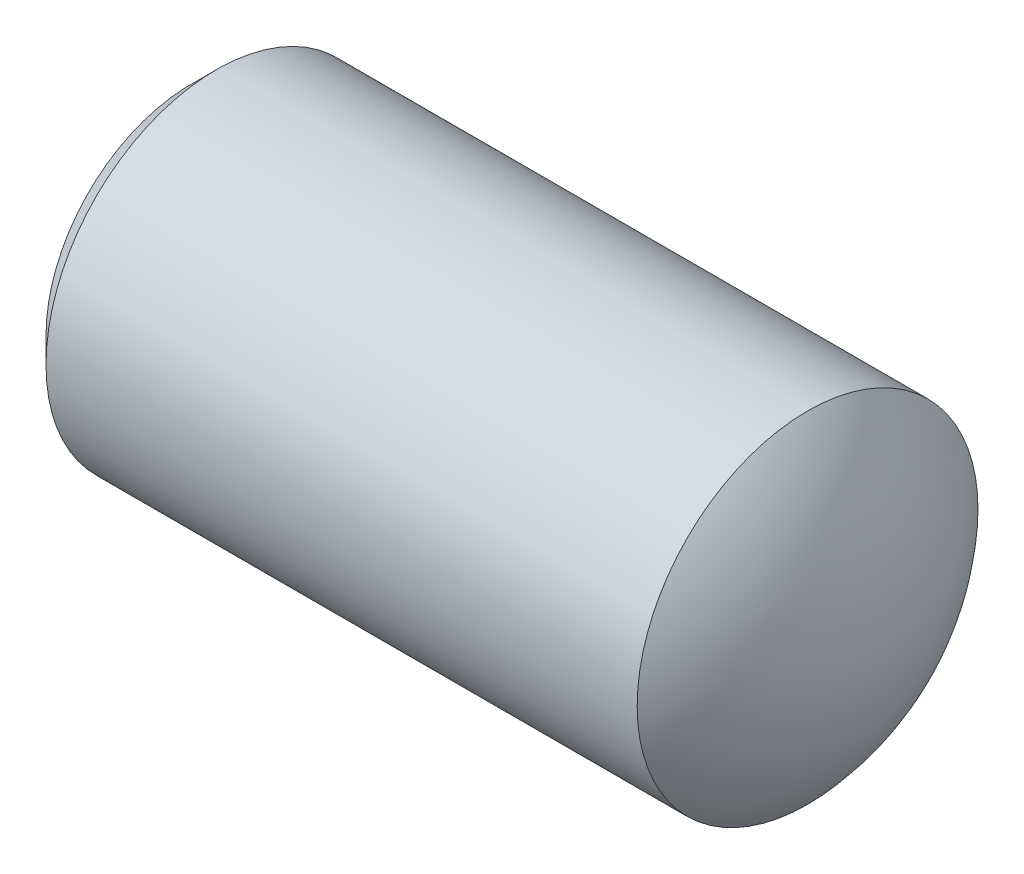
ISO-10303-21;
HEADER;
FILE_DESCRIPTION(('STEP AP214'),'2;1');
FILE_NAME('part.step','',(''),(''),'','','');
FILE_SCHEMA(('AUTOMOTIVE_DESIGN { 1 0 10303 214 1 1 1 1 }'));
ENDSEC;
DATA;
#1=APPLICATION_CONTEXT('core data for automotive mechanical design processes');
#2=APPLICATION_PROTOCOL_DEFINITION('international standard','automotive_design',2000,#1);
#3=PRODUCT_CONTEXT('',#1,'mechanical');
#4=PRODUCT('Part','Part','',(#3));
#5=PRODUCT_RELATED_PRODUCT_CATEGORY('part','',(#4));
#6=PRODUCT_DEFINITION_FORMATION('','',#4);
#7=PRODUCT_DEFINITION_CONTEXT('part definition',#1,'design');
#8=PRODUCT_DEFINITION('design','',#6,#7);
#9=PRODUCT_DEFINITION_SHAPE('','',#8);
#10=(LENGTH_UNIT() NAMED_UNIT(*) SI_UNIT(.MILLI.,.METRE.));
#11=(NAMED_UNIT(*) PLANE_ANGLE_UNIT() SI_UNIT($,.RADIAN.));
#12=(NAMED_UNIT(*) SI_UNIT($,.STERADIAN.) SOLID_ANGLE_UNIT());
#13=UNCERTAINTY_MEASURE_WITH_UNIT(LENGTH_MEASURE(1.E-05),#10,'distance_accuracy_value','');
#14=(GEOMETRIC_REPRESENTATION_CONTEXT(3) GLOBAL_UNCERTAINTY_ASSIGNED_CONTEXT((#13)) GLOBAL_UNIT_ASSIGNED_CONTEXT((#10,
#11,#12)) REPRESENTATION_CONTEXT('',''));
#15=CARTESIAN_POINT('',(0.,0.,0.));
#16=DIRECTION('',(0.,0.,1.));
#17=DIRECTION('',(1.,0.,0.));
#18=AXIS2_PLACEMENT_3D('',#15,#16,#17);
#19=CARTESIAN_POINT('',(0.,0.,0.));
#20=DIRECTION('',(-1.,0.,0.));
#21=DIRECTION('',(0.,0.,1.));
#22=AXIS2_PLACEMENT_3D('',#19,#20,#21);
#23=PLANE('',#22);
#24=CARTESIAN_POINT('',(0.,0.,0.));
#25=DIRECTION('',(-1.,0.,0.));
#26=DIRECTION('',(0.,0.,1.));
#27=AXIS2_PLACEMENT_3D('',#24,#25,#26);
#28=CIRCLE('',#27,10.81024);
#29=CARTESIAN_POINT('',(0.,0.,10.81024));
#30=VERTEX_POINT('',#29);
#31=EDGE_CURVE('E134',#30,#30,#28,.T.);
#32=ORIENTED_EDGE('',*,*,#31,.T.);
#33=EDGE_LOOP('',(#32));
#34=FACE_BOUND('',#33,.T.);
#35=DIRECTION('',(0.,0.,-1.));
#36=VECTOR('',#35,1.);
#37=CARTESIAN_POINT('',(0.,7.1374,4.12077981131403));
#38=LINE('',#37,#36);
#39=CARTESIAN_POINT('',(0.,7.1374,4.12077981131403));
#40=VERTEX_POINT('',#39);
#41=CARTESIAN_POINT('',(0.,7.1374,-4.12077981131404));
#42=VERTEX_POINT('',#41);
#43=EDGE_CURVE('E125',#40,#42,#38,.T.);
#44=ORIENTED_EDGE('',*,*,#43,.F.);
#45=DIRECTION('',(0.,-0.866025403784439,0.5));
#46=VECTOR('',#45,1.);
#47=CARTESIAN_POINT('',(0.,7.1374,4.12077981131403));
#48=LINE('',#47,#46);
#49=CARTESIAN_POINT('',(0.,0.,8.24155962262807));
#50=VERTEX_POINT('',#49);
#51=EDGE_CURVE('E47',#40,#50,#48,.T.);
#52=ORIENTED_EDGE('',*,*,#51,.T.);
#53=DIRECTION('',(0.,0.866025403784439,0.5));
#54=VECTOR('',#53,1.);
#55=CARTESIAN_POINT('',(0.,-7.13739999999999,4.12077981131404));
#56=LINE('',#55,#54);
#57=CARTESIAN_POINT('',(0.,-7.13739999999999,4.12077981131404));
#58=VERTEX_POINT('',#57);
#59=EDGE_CURVE('E116',#58,#50,#56,.T.);
#60=ORIENTED_EDGE('',*,*,#59,.F.);
#61=DIRECTION('',(0.,0.,-1.));
#62=VECTOR('',#61,1.);
#63=CARTESIAN_POINT('',(0.,-7.13739999999999,4.12077981131404));
#64=LINE('',#63,#62);
#65=CARTESIAN_POINT('',(0.,-7.13739999999999,-4.12077981131403));
#66=VERTEX_POINT('',#65);
#67=EDGE_CURVE('E119',#58,#66,#64,.T.);
#68=ORIENTED_EDGE('',*,*,#67,.T.);
#69=DIRECTION('',(0.,0.866025403784438,-0.500000000000001));
#70=VECTOR('',#69,1.);
#71=CARTESIAN_POINT('',(0.,-7.13739999999999,-4.12077981131403));
#72=LINE('',#71,#70);
#73=CARTESIAN_POINT('',(0.,0.,-8.24155962262807));
#74=VERTEX_POINT('',#73);
#75=EDGE_CURVE('E122',#66,#74,#72,.T.);
#76=ORIENTED_EDGE('',*,*,#75,.T.);
#77=DIRECTION('',(0.,-0.866025403784439,-0.5));
#78=VECTOR('',#77,1.);
#79=CARTESIAN_POINT('',(0.,7.1374,-4.12077981131404));
#80=LINE('',#79,#78);
#81=EDGE_CURVE('E105',#42,#74,#80,.T.);
#82=ORIENTED_EDGE('',*,*,#81,.F.);
#83=EDGE_LOOP('',(#44,#52,#60,#68,#76,#82));
#84=FACE_BOUND('',#83,.T.);
#85=ADVANCED_FACE('F32',(#34,#84),#23,.T.);
#86=CARTESIAN_POINT('',(31.75,0.,0.));
#87=DIRECTION('',(-1.,0.,0.));
#88=DIRECTION('',(0.,1.,0.));
#89=AXIS2_PLACEMENT_3D('',#86,#87,#88);
#90=SPHERICAL_SURFACE('',#89,19.05);
#91=CARTESIAN_POINT('',(45.9490316571237,0.,0.));
#92=DIRECTION('',(-1.,0.,0.));
#93=DIRECTION('',(0.,0.,1.));
#94=AXIS2_PLACEMENT_3D('',#91,#92,#93);
#95=CIRCLE('',#94,12.7);
#96=CARTESIAN_POINT('',(45.9490316571237,0.,12.7));
#97=VERTEX_POINT('',#96);
#98=EDGE_CURVE('E11',#97,#97,#95,.T.);
#99=ORIENTED_EDGE('',*,*,#98,.F.);
#100=EDGE_LOOP('',(#99));
#101=FACE_BOUND('',#100,.T.);
#102=ADVANCED_FACE('F34',(#101),#90,.T.);
#103=CARTESIAN_POINT('',(-12.7,0.,0.));
#104=DIRECTION('',(-1.,0.,0.));
#105=DIRECTION('',(0.,0.,1.));
#106=AXIS2_PLACEMENT_3D('',#103,#104,#105);
#107=CYLINDRICAL_SURFACE('',#106,12.7);
#108=ORIENTED_EDGE('',*,*,#98,.T.);
#109=EDGE_LOOP('',(#108));
#110=FACE_BOUND('',#109,.T.);
#111=CARTESIAN_POINT('',(1.88976,0.,0.));
#112=DIRECTION('',(-1.,0.,0.));
#113=DIRECTION('',(0.,0.,1.));
#114=AXIS2_PLACEMENT_3D('',#111,#112,#113);
#115=CIRCLE('',#114,12.7);
#116=CARTESIAN_POINT('',(1.88976,0.,12.7));
#117=VERTEX_POINT('',#116);
#118=EDGE_CURVE('E40',#117,#117,#115,.T.);
#119=ORIENTED_EDGE('',*,*,#118,.F.);
#120=EDGE_LOOP('',(#119));
#121=FACE_BOUND('',#120,.T.);
#122=ADVANCED_FACE('F142',(#110,#121),#107,.T.);
#123=CARTESIAN_POINT('',(0.,0.,0.));
#124=DIRECTION('',(1.,0.,0.));
#125=DIRECTION('',(0.,0.,-1.));
#126=AXIS2_PLACEMENT_3D('',#123,#124,#125);
#127=CONICAL_SURFACE('',#126,10.81024,0.785398163397449);
#128=ORIENTED_EDGE('',*,*,#118,.T.);
#129=EDGE_LOOP('',(#128));
#130=FACE_BOUND('',#129,.T.);
#131=ORIENTED_EDGE('',*,*,#31,.F.);
#132=EDGE_LOOP('',(#131));
#133=FACE_BOUND('',#132,.T.);
#134=ADVANCED_FACE('F139',(#130,#133),#127,.T.);
#135=CARTESIAN_POINT('',(14.2748,7.1374,4.12077981131403));
#136=DIRECTION('',(0.,-0.5,-0.866025403784438));
#137=DIRECTION('',(0.,0.866025403784439,-0.5));
#138=AXIS2_PLACEMENT_3D('',#135,#136,#137);
#139=PLANE('',#138);
#140=ORIENTED_EDGE('',*,*,#51,.F.);
#141=DIRECTION('',(-1.,0.,0.));
#142=VECTOR('',#141,1.);
#143=CARTESIAN_POINT('',(14.2748,7.1374,4.12077981131403));
#144=LINE('',#143,#142);
#145=CARTESIAN_POINT('',(14.2748,7.1374,4.12077981131403));
#146=VERTEX_POINT('',#145);
#147=EDGE_CURVE('E52',#146,#40,#144,.T.);
#148=ORIENTED_EDGE('',*,*,#147,.F.);
#149=DIRECTION('',(0.,-0.866025403784439,0.5));
#150=VECTOR('',#149,1.);
#151=CARTESIAN_POINT('',(14.2748,7.1374,4.12077981131403));
#152=LINE('',#151,#150);
#153=CARTESIAN_POINT('',(14.2748,0.,8.24155962262807));
#154=VERTEX_POINT('',#153);
#155=EDGE_CURVE('E79',#146,#154,#152,.T.);
#156=ORIENTED_EDGE('',*,*,#155,.T.);
#157=DIRECTION('',(-1.,0.,0.));
#158=VECTOR('',#157,1.);
#159=CARTESIAN_POINT('',(14.2748,0.,8.24155962262807));
#160=LINE('',#159,#158);
#161=EDGE_CURVE('E132',#154,#50,#160,.T.);
#162=ORIENTED_EDGE('',*,*,#161,.T.);
#163=EDGE_LOOP('',(#140,#148,#156,#162));
#164=FACE_BOUND('',#163,.T.);
#165=ADVANCED_FACE('F149',(#164),#139,.T.);
#166=CARTESIAN_POINT('',(14.2748,-7.13739999999999,4.12077981131404));
#167=DIRECTION('',(0.,-0.5,0.866025403784439));
#168=DIRECTION('',(0.,-0.866025403784439,-0.5));
#169=AXIS2_PLACEMENT_3D('',#166,#167,#168);
#170=PLANE('',#169);
#171=ORIENTED_EDGE('',*,*,#59,.T.);
#172=ORIENTED_EDGE('',*,*,#161,.F.);
#173=DIRECTION('',(0.,0.866025403784439,0.5));
#174=VECTOR('',#173,1.);
#175=CARTESIAN_POINT('',(14.2748,-7.13739999999999,4.12077981131404));
#176=LINE('',#175,#174);
#177=CARTESIAN_POINT('',(14.2748,-7.13739999999999,4.12077981131404));
#178=VERTEX_POINT('',#177);
#179=EDGE_CURVE('E245',#178,#154,#176,.T.);
#180=ORIENTED_EDGE('',*,*,#179,.F.);
#181=DIRECTION('',(-1.,0.,0.));
#182=VECTOR('',#181,1.);
#183=CARTESIAN_POINT('',(14.2748,-7.13739999999999,4.12077981131404));
#184=LINE('',#183,#182);
#185=EDGE_CURVE('E130',#178,#58,#184,.T.);
#186=ORIENTED_EDGE('',*,*,#185,.T.);
#187=EDGE_LOOP('',(#171,#172,#180,#186));
#188=FACE_BOUND('',#187,.T.);
#189=ADVANCED_FACE('F161',(#188),#170,.F.);
#190=CARTESIAN_POINT('',(14.2748,-7.13739999999999,4.12077981131404));
#191=DIRECTION('',(0.,1.,0.));
#192=DIRECTION('',(0.,0.,1.));
#193=AXIS2_PLACEMENT_3D('',#190,#191,#192);
#194=PLANE('',#193);
#195=ORIENTED_EDGE('',*,*,#67,.F.);
#196=ORIENTED_EDGE('',*,*,#185,.F.);
#197=DIRECTION('',(0.,0.,-1.));
#198=VECTOR('',#197,1.);
#199=CARTESIAN_POINT('',(14.2748,-7.13739999999999,4.12077981131404));
#200=LINE('',#199,#198);
#201=CARTESIAN_POINT('',(14.2748,-7.13739999999999,-4.12077981131403));
#202=VERTEX_POINT('',#201);
#203=EDGE_CURVE('E100',#178,#202,#200,.T.);
#204=ORIENTED_EDGE('',*,*,#203,.T.);
#205=DIRECTION('',(-1.,0.,0.));
#206=VECTOR('',#205,1.);
#207=CARTESIAN_POINT('',(14.2748,-7.13739999999999,-4.12077981131403));
#208=LINE('',#207,#206);
#209=EDGE_CURVE('E95',#202,#66,#208,.T.);
#210=ORIENTED_EDGE('',*,*,#209,.T.);
#211=EDGE_LOOP('',(#195,#196,#204,#210));
#212=FACE_BOUND('',#211,.T.);
#213=ADVANCED_FACE('F164',(#212),#194,.T.);
#214=CARTESIAN_POINT('',(14.2748,-7.13739999999999,-4.12077981131403));
#215=DIRECTION('',(0.,0.500000000000001,0.866025403784438));
#216=DIRECTION('',(0.,-0.866025403784438,0.500000000000001));
#217=AXIS2_PLACEMENT_3D('',#214,#215,#216);
#218=PLANE('',#217);
#219=ORIENTED_EDGE('',*,*,#75,.F.);
#220=ORIENTED_EDGE('',*,*,#209,.F.);
#221=DIRECTION('',(0.,0.866025403784438,-0.500000000000001));
#222=VECTOR('',#221,1.);
#223=CARTESIAN_POINT('',(14.2748,-7.13739999999999,-4.12077981131403));
#224=LINE('',#223,#222);
#225=CARTESIAN_POINT('',(14.2748,0.,-8.24155962262807));
#226=VERTEX_POINT('',#225);
#227=EDGE_CURVE('E90',#202,#226,#224,.T.);
#228=ORIENTED_EDGE('',*,*,#227,.T.);
#229=DIRECTION('',(-1.,0.,0.));
#230=VECTOR('',#229,1.);
#231=CARTESIAN_POINT('',(14.2748,0.,-8.24155962262807));
#232=LINE('',#231,#230);
#233=EDGE_CURVE('E94',#226,#74,#232,.T.);
#234=ORIENTED_EDGE('',*,*,#233,.T.);
#235=EDGE_LOOP('',(#219,#220,#228,#234));
#236=FACE_BOUND('',#235,.T.);
#237=ADVANCED_FACE('F93',(#236),#218,.T.);
#238=CARTESIAN_POINT('',(14.2748,7.1374,-4.12077981131404));
#239=DIRECTION('',(0.,0.5,-0.866025403784439));
#240=DIRECTION('',(0.,0.866025403784439,0.5));
#241=AXIS2_PLACEMENT_3D('',#238,#239,#240);
#242=PLANE('',#241);
#243=ORIENTED_EDGE('',*,*,#81,.T.);
#244=ORIENTED_EDGE('',*,*,#233,.F.);
#245=DIRECTION('',(0.,-0.866025403784439,-0.5));
#246=VECTOR('',#245,1.);
#247=CARTESIAN_POINT('',(14.2748,7.1374,-4.12077981131404));
#248=LINE('',#247,#246);
#249=CARTESIAN_POINT('',(14.2748,7.1374,-4.12077981131404));
#250=VERTEX_POINT('',#249);
#251=EDGE_CURVE('E99',#250,#226,#248,.T.);
#252=ORIENTED_EDGE('',*,*,#251,.F.);
#253=DIRECTION('',(-1.,0.,0.));
#254=VECTOR('',#253,1.);
#255=CARTESIAN_POINT('',(14.2748,7.1374,-4.12077981131404));
#256=LINE('',#255,#254);
#257=EDGE_CURVE('E75',#250,#42,#256,.T.);
#258=ORIENTED_EDGE('',*,*,#257,.T.);
#259=EDGE_LOOP('',(#243,#244,#252,#258));
#260=FACE_BOUND('',#259,.T.);
#261=ADVANCED_FACE('F102',(#260),#242,.F.);
#262=CARTESIAN_POINT('',(14.2748,7.1374,4.12077981131403));
#263=DIRECTION('',(0.,1.,0.));
#264=DIRECTION('',(0.,0.,1.));
#265=AXIS2_PLACEMENT_3D('',#262,#263,#264);
#266=PLANE('',#265);
#267=ORIENTED_EDGE('',*,*,#43,.T.);
#268=ORIENTED_EDGE('',*,*,#257,.F.);
#269=DIRECTION('',(0.,0.,-1.));
#270=VECTOR('',#269,1.);
#271=CARTESIAN_POINT('',(14.2748,7.1374,4.12077981131403));
#272=LINE('',#271,#270);
#273=EDGE_CURVE('E110',#146,#250,#272,.T.);
#274=ORIENTED_EDGE('',*,*,#273,.F.);
#275=ORIENTED_EDGE('',*,*,#147,.T.);
#276=EDGE_LOOP('',(#267,#268,#274,#275));
#277=FACE_BOUND('',#276,.T.);
#278=ADVANCED_FACE('F173',(#277),#266,.F.);
#279=CARTESIAN_POINT('',(14.2748,14.2748,0.));
#280=DIRECTION('',(1.,0.,0.));
#281=DIRECTION('',(0.,0.,-1.));
#282=AXIS2_PLACEMENT_3D('',#279,#280,#281);
#283=PLANE('',#282);
#284=ORIENTED_EDGE('',*,*,#155,.F.);
#285=ORIENTED_EDGE('',*,*,#273,.T.);
#286=ORIENTED_EDGE('',*,*,#251,.T.);
#287=ORIENTED_EDGE('',*,*,#227,.F.);
#288=ORIENTED_EDGE('',*,*,#203,.F.);
#289=ORIENTED_EDGE('',*,*,#179,.T.);
#290=EDGE_LOOP('',(#284,#285,#286,#287,#288,#289));
#291=FACE_BOUND('',#290,.T.);
#292=ADVANCED_FACE('F108',(#291),#283,.F.);
#293=CLOSED_SHELL('',(#85,#102,#122,#134,#165,#189,#213,#237,#261,#278,#292));
#294=MANIFOLD_SOLID_BREP('B2',#293);
#295=ADVANCED_BREP_SHAPE_REPRESENTATION('',(#18,#294),#14);
#296=SHAPE_DEFINITION_REPRESENTATION(#9,#295);
ENDSEC;
END-ISO-10303-21;
